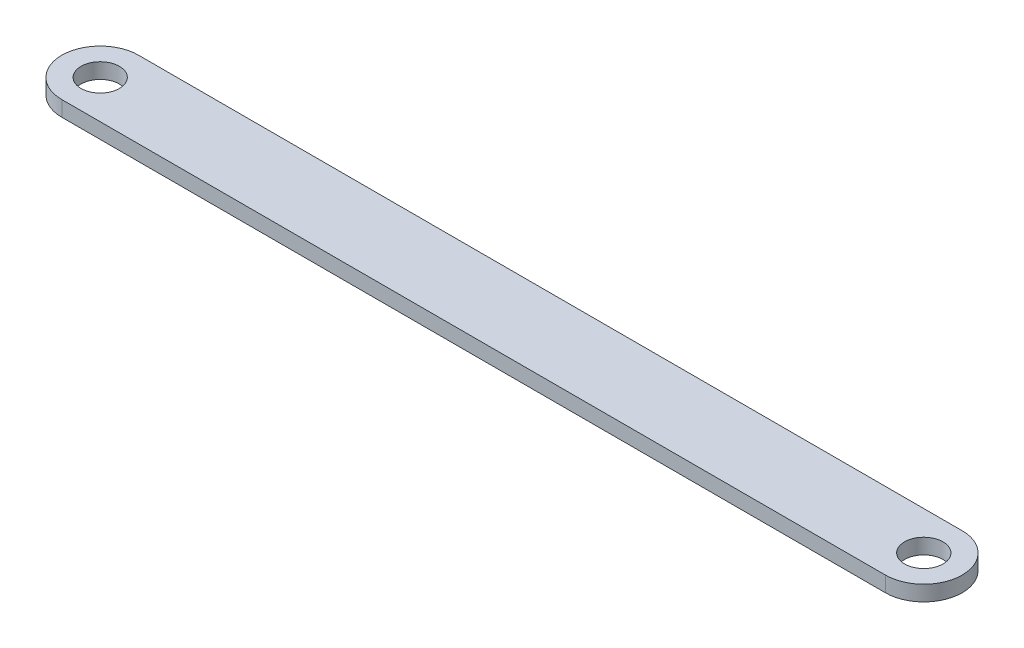
ISO-10303-21;
HEADER;
FILE_DESCRIPTION(('STEP AP214'),'2;1');
FILE_NAME('part.step','',(''),(''),'','','');
FILE_SCHEMA(('AUTOMOTIVE_DESIGN { 1 0 10303 214 1 1 1 1 }'));
ENDSEC;
DATA;
#1=APPLICATION_CONTEXT('core data for automotive mechanical design processes');
#2=APPLICATION_PROTOCOL_DEFINITION('international standard','automotive_design',2000,#1);
#3=PRODUCT_CONTEXT('',#1,'mechanical');
#4=PRODUCT('Part','Part','',(#3));
#5=PRODUCT_RELATED_PRODUCT_CATEGORY('part','',(#4));
#6=PRODUCT_DEFINITION_FORMATION('','',#4);
#7=PRODUCT_DEFINITION_CONTEXT('part definition',#1,'design');
#8=PRODUCT_DEFINITION('design','',#6,#7);
#9=PRODUCT_DEFINITION_SHAPE('','',#8);
#10=(LENGTH_UNIT() NAMED_UNIT(*) SI_UNIT(.MILLI.,.METRE.));
#11=(NAMED_UNIT(*) PLANE_ANGLE_UNIT() SI_UNIT($,.RADIAN.));
#12=(NAMED_UNIT(*) SI_UNIT($,.STERADIAN.) SOLID_ANGLE_UNIT());
#13=UNCERTAINTY_MEASURE_WITH_UNIT(LENGTH_MEASURE(1.E-05),#10,'distance_accuracy_value','');
#14=(GEOMETRIC_REPRESENTATION_CONTEXT(3) GLOBAL_UNCERTAINTY_ASSIGNED_CONTEXT((#13)) GLOBAL_UNIT_ASSIGNED_CONTEXT((#10,
#11,#12)) REPRESENTATION_CONTEXT('',''));
#15=CARTESIAN_POINT('',(0.,0.,0.));
#16=DIRECTION('',(0.,0.,1.));
#17=DIRECTION('',(1.,0.,0.));
#18=AXIS2_PLACEMENT_3D('',#15,#16,#17);
#19=CARTESIAN_POINT('',(0.,5.08,0.));
#20=DIRECTION('',(0.,-1.,0.));
#21=DIRECTION('',(0.,0.,-1.));
#22=AXIS2_PLACEMENT_3D('',#19,#20,#21);
#23=PLANE('',#22);
#24=CARTESIAN_POINT('',(0.,5.08,0.));
#25=DIRECTION('',(0.,1.,0.));
#26=DIRECTION('',(0.,0.,-1.));
#27=AXIS2_PLACEMENT_3D('',#24,#25,#26);
#28=CIRCLE('',#27,12.7);
#29=CARTESIAN_POINT('',(0.,5.08,12.7));
#30=VERTEX_POINT('',#29);
#31=CARTESIAN_POINT('',(0.,5.08,-12.7));
#32=VERTEX_POINT('',#31);
#33=EDGE_CURVE('E95',#30,#32,#28,.T.);
#34=ORIENTED_EDGE('',*,*,#33,.T.);
#35=DIRECTION('',(-1.,0.,0.));
#36=VECTOR('',#35,1.);
#37=CARTESIAN_POINT('',(-272.4,5.08,-12.7));
#38=LINE('',#37,#36);
#39=CARTESIAN_POINT('',(-272.4,5.08,-12.7));
#40=VERTEX_POINT('',#39);
#41=EDGE_CURVE('E90',#32,#40,#38,.T.);
#42=ORIENTED_EDGE('',*,*,#41,.T.);
#43=CARTESIAN_POINT('',(-272.4,5.08,0.));
#44=DIRECTION('',(0.,1.,0.));
#45=DIRECTION('',(0.,0.,1.));
#46=AXIS2_PLACEMENT_3D('',#43,#44,#45);
#47=CIRCLE('',#46,12.7);
#48=CARTESIAN_POINT('',(-272.4,5.08,12.7));
#49=VERTEX_POINT('',#48);
#50=EDGE_CURVE('E93',#40,#49,#47,.T.);
#51=ORIENTED_EDGE('',*,*,#50,.T.);
#52=DIRECTION('',(1.,0.,0.));
#53=VECTOR('',#52,1.);
#54=CARTESIAN_POINT('',(-272.4,5.08,12.7));
#55=LINE('',#54,#53);
#56=EDGE_CURVE('E60',#49,#30,#55,.T.);
#57=ORIENTED_EDGE('',*,*,#56,.T.);
#58=EDGE_LOOP('',(#34,#42,#51,#57));
#59=FACE_BOUND('',#58,.T.);
#60=CARTESIAN_POINT('',(0.,5.08,0.));
#61=DIRECTION('',(0.,1.,0.));
#62=DIRECTION('',(0.,0.,1.));
#63=AXIS2_PLACEMENT_3D('',#60,#61,#62);
#64=CIRCLE('',#63,6.35);
#65=CARTESIAN_POINT('',(0.,5.08,6.35));
#66=VERTEX_POINT('',#65);
#67=EDGE_CURVE('E110',#66,#66,#64,.T.);
#68=ORIENTED_EDGE('',*,*,#67,.F.);
#69=EDGE_LOOP('',(#68));
#70=FACE_BOUND('',#69,.T.);
#71=CARTESIAN_POINT('',(-272.4,5.08,0.));
#72=DIRECTION('',(0.,1.,0.));
#73=DIRECTION('',(0.,0.,1.));
#74=AXIS2_PLACEMENT_3D('',#71,#72,#73);
#75=CIRCLE('',#74,6.35);
#76=CARTESIAN_POINT('',(-272.4,5.08,6.35000000000003));
#77=VERTEX_POINT('',#76);
#78=EDGE_CURVE('E125',#77,#77,#75,.T.);
#79=ORIENTED_EDGE('',*,*,#78,.F.);
#80=EDGE_LOOP('',(#79));
#81=FACE_BOUND('',#80,.T.);
#82=ADVANCED_FACE('F43',(#59,#70,#81),#23,.F.);
#83=CARTESIAN_POINT('',(0.,0.,0.));
#84=DIRECTION('',(0.,-1.,0.));
#85=DIRECTION('',(0.,0.,-1.));
#86=AXIS2_PLACEMENT_3D('',#83,#84,#85);
#87=PLANE('',#86);
#88=CARTESIAN_POINT('',(0.,0.,0.));
#89=DIRECTION('',(0.,1.,0.));
#90=DIRECTION('',(0.,0.,1.));
#91=AXIS2_PLACEMENT_3D('',#88,#89,#90);
#92=CIRCLE('',#91,6.35);
#93=CARTESIAN_POINT('',(0.,0.,6.35));
#94=VERTEX_POINT('',#93);
#95=EDGE_CURVE('E122',#94,#94,#92,.T.);
#96=ORIENTED_EDGE('',*,*,#95,.T.);
#97=EDGE_LOOP('',(#96));
#98=FACE_BOUND('',#97,.T.);
#99=CARTESIAN_POINT('',(0.,0.,0.));
#100=DIRECTION('',(0.,1.,0.));
#101=DIRECTION('',(0.,0.,-1.));
#102=AXIS2_PLACEMENT_3D('',#99,#100,#101);
#103=CIRCLE('',#102,12.7);
#104=CARTESIAN_POINT('',(0.,0.,12.7));
#105=VERTEX_POINT('',#104);
#106=CARTESIAN_POINT('',(0.,0.,-12.7));
#107=VERTEX_POINT('',#106);
#108=EDGE_CURVE('E107',#105,#107,#103,.T.);
#109=ORIENTED_EDGE('',*,*,#108,.F.);
#110=DIRECTION('',(1.,0.,0.));
#111=VECTOR('',#110,1.);
#112=CARTESIAN_POINT('',(-272.4,0.,12.7));
#113=LINE('',#112,#111);
#114=CARTESIAN_POINT('',(-272.4,0.,12.7));
#115=VERTEX_POINT('',#114);
#116=EDGE_CURVE('E83',#115,#105,#113,.T.);
#117=ORIENTED_EDGE('',*,*,#116,.F.);
#118=CARTESIAN_POINT('',(-272.4,0.,0.));
#119=DIRECTION('',(0.,1.,0.));
#120=DIRECTION('',(0.,0.,1.));
#121=AXIS2_PLACEMENT_3D('',#118,#119,#120);
#122=CIRCLE('',#121,12.7);
#123=CARTESIAN_POINT('',(-272.4,0.,-12.7));
#124=VERTEX_POINT('',#123);
#125=EDGE_CURVE('E77',#124,#115,#122,.T.);
#126=ORIENTED_EDGE('',*,*,#125,.F.);
#127=DIRECTION('',(-1.,0.,0.));
#128=VECTOR('',#127,1.);
#129=CARTESIAN_POINT('',(-272.4,0.,-12.7));
#130=LINE('',#129,#128);
#131=EDGE_CURVE('E99',#107,#124,#130,.T.);
#132=ORIENTED_EDGE('',*,*,#131,.F.);
#133=EDGE_LOOP('',(#109,#117,#126,#132));
#134=FACE_BOUND('',#133,.T.);
#135=CARTESIAN_POINT('',(-272.4,0.,0.));
#136=DIRECTION('',(0.,1.,0.));
#137=DIRECTION('',(0.,0.,1.));
#138=AXIS2_PLACEMENT_3D('',#135,#136,#137);
#139=CIRCLE('',#138,6.35);
#140=CARTESIAN_POINT('',(-272.4,0.,6.35000000000003));
#141=VERTEX_POINT('',#140);
#142=EDGE_CURVE('E128',#141,#141,#139,.T.);
#143=ORIENTED_EDGE('',*,*,#142,.T.);
#144=EDGE_LOOP('',(#143));
#145=FACE_BOUND('',#144,.T.);
#146=ADVANCED_FACE('F118',(#98,#134,#145),#87,.T.);
#147=CARTESIAN_POINT('',(0.,5.08,0.));
#148=DIRECTION('',(0.,-1.,0.));
#149=DIRECTION('',(0.,0.,-1.));
#150=AXIS2_PLACEMENT_3D('',#147,#148,#149);
#151=CYLINDRICAL_SURFACE('',#150,12.7);
#152=ORIENTED_EDGE('',*,*,#108,.T.);
#153=DIRECTION('',(0.,-1.,0.));
#154=VECTOR('',#153,1.);
#155=CARTESIAN_POINT('',(0.,5.08,-12.7));
#156=LINE('',#155,#154);
#157=EDGE_CURVE('E11',#32,#107,#156,.T.);
#158=ORIENTED_EDGE('',*,*,#157,.F.);
#159=ORIENTED_EDGE('',*,*,#33,.F.);
#160=DIRECTION('',(0.,-1.,0.));
#161=VECTOR('',#160,1.);
#162=CARTESIAN_POINT('',(0.,5.08,12.7));
#163=LINE('',#162,#161);
#164=EDGE_CURVE('E103',#30,#105,#163,.T.);
#165=ORIENTED_EDGE('',*,*,#164,.T.);
#166=EDGE_LOOP('',(#152,#158,#159,#165));
#167=FACE_BOUND('',#166,.T.);
#168=ADVANCED_FACE('F45',(#167),#151,.T.);
#169=CARTESIAN_POINT('',(-272.4,5.08,-12.7));
#170=DIRECTION('',(0.,0.,1.));
#171=DIRECTION('',(1.,0.,0.));
#172=AXIS2_PLACEMENT_3D('',#169,#170,#171);
#173=PLANE('',#172);
#174=ORIENTED_EDGE('',*,*,#131,.T.);
#175=DIRECTION('',(0.,-1.,0.));
#176=VECTOR('',#175,1.);
#177=CARTESIAN_POINT('',(-272.4,5.08,-12.7));
#178=LINE('',#177,#176);
#179=EDGE_CURVE('E52',#40,#124,#178,.T.);
#180=ORIENTED_EDGE('',*,*,#179,.F.);
#181=ORIENTED_EDGE('',*,*,#41,.F.);
#182=ORIENTED_EDGE('',*,*,#157,.T.);
#183=EDGE_LOOP('',(#174,#180,#181,#182));
#184=FACE_BOUND('',#183,.T.);
#185=ADVANCED_FACE('F98',(#184),#173,.F.);
#186=CARTESIAN_POINT('',(-272.4,5.08,0.));
#187=DIRECTION('',(0.,-1.,0.));
#188=DIRECTION('',(0.,0.,-1.));
#189=AXIS2_PLACEMENT_3D('',#186,#187,#188);
#190=CYLINDRICAL_SURFACE('',#189,12.7);
#191=ORIENTED_EDGE('',*,*,#125,.T.);
#192=DIRECTION('',(0.,-1.,0.));
#193=VECTOR('',#192,1.);
#194=CARTESIAN_POINT('',(-272.4,5.08,12.7));
#195=LINE('',#194,#193);
#196=EDGE_CURVE('E100',#49,#115,#195,.T.);
#197=ORIENTED_EDGE('',*,*,#196,.F.);
#198=ORIENTED_EDGE('',*,*,#50,.F.);
#199=ORIENTED_EDGE('',*,*,#179,.T.);
#200=EDGE_LOOP('',(#191,#197,#198,#199));
#201=FACE_BOUND('',#200,.T.);
#202=ADVANCED_FACE('F101',(#201),#190,.T.);
#203=CARTESIAN_POINT('',(-272.4,5.08,12.7));
#204=DIRECTION('',(0.,0.,-1.));
#205=DIRECTION('',(-1.,0.,0.));
#206=AXIS2_PLACEMENT_3D('',#203,#204,#205);
#207=PLANE('',#206);
#208=ORIENTED_EDGE('',*,*,#116,.T.);
#209=ORIENTED_EDGE('',*,*,#164,.F.);
#210=ORIENTED_EDGE('',*,*,#56,.F.);
#211=ORIENTED_EDGE('',*,*,#196,.T.);
#212=EDGE_LOOP('',(#208,#209,#210,#211));
#213=FACE_BOUND('',#212,.T.);
#214=ADVANCED_FACE('F115',(#213),#207,.F.);
#215=CARTESIAN_POINT('',(0.,5.08,0.));
#216=DIRECTION('',(0.,-1.,0.));
#217=DIRECTION('',(0.,0.,-1.));
#218=AXIS2_PLACEMENT_3D('',#215,#216,#217);
#219=CYLINDRICAL_SURFACE('',#218,6.35);
#220=ORIENTED_EDGE('',*,*,#67,.T.);
#221=EDGE_LOOP('',(#220));
#222=FACE_BOUND('',#221,.T.);
#223=ORIENTED_EDGE('',*,*,#95,.F.);
#224=EDGE_LOOP('',(#223));
#225=FACE_BOUND('',#224,.T.);
#226=ADVANCED_FACE('F145',(#222,#225),#219,.F.);
#227=CARTESIAN_POINT('',(-272.4,5.08,0.));
#228=DIRECTION('',(0.,-1.,0.));
#229=DIRECTION('',(0.,0.,-1.));
#230=AXIS2_PLACEMENT_3D('',#227,#228,#229);
#231=CYLINDRICAL_SURFACE('',#230,6.35);
#232=ORIENTED_EDGE('',*,*,#78,.T.);
#233=EDGE_LOOP('',(#232));
#234=FACE_BOUND('',#233,.T.);
#235=ORIENTED_EDGE('',*,*,#142,.F.);
#236=EDGE_LOOP('',(#235));
#237=FACE_BOUND('',#236,.T.);
#238=ADVANCED_FACE('F134',(#234,#237),#231,.F.);
#239=CLOSED_SHELL('',(#82,#146,#168,#185,#202,#214,#226,#238));
#240=MANIFOLD_SOLID_BREP('B2',#239);
#241=ADVANCED_BREP_SHAPE_REPRESENTATION('',(#18,#240),#14);
#242=SHAPE_DEFINITION_REPRESENTATION(#9,#241);
ENDSEC;
END-ISO-10303-21;
